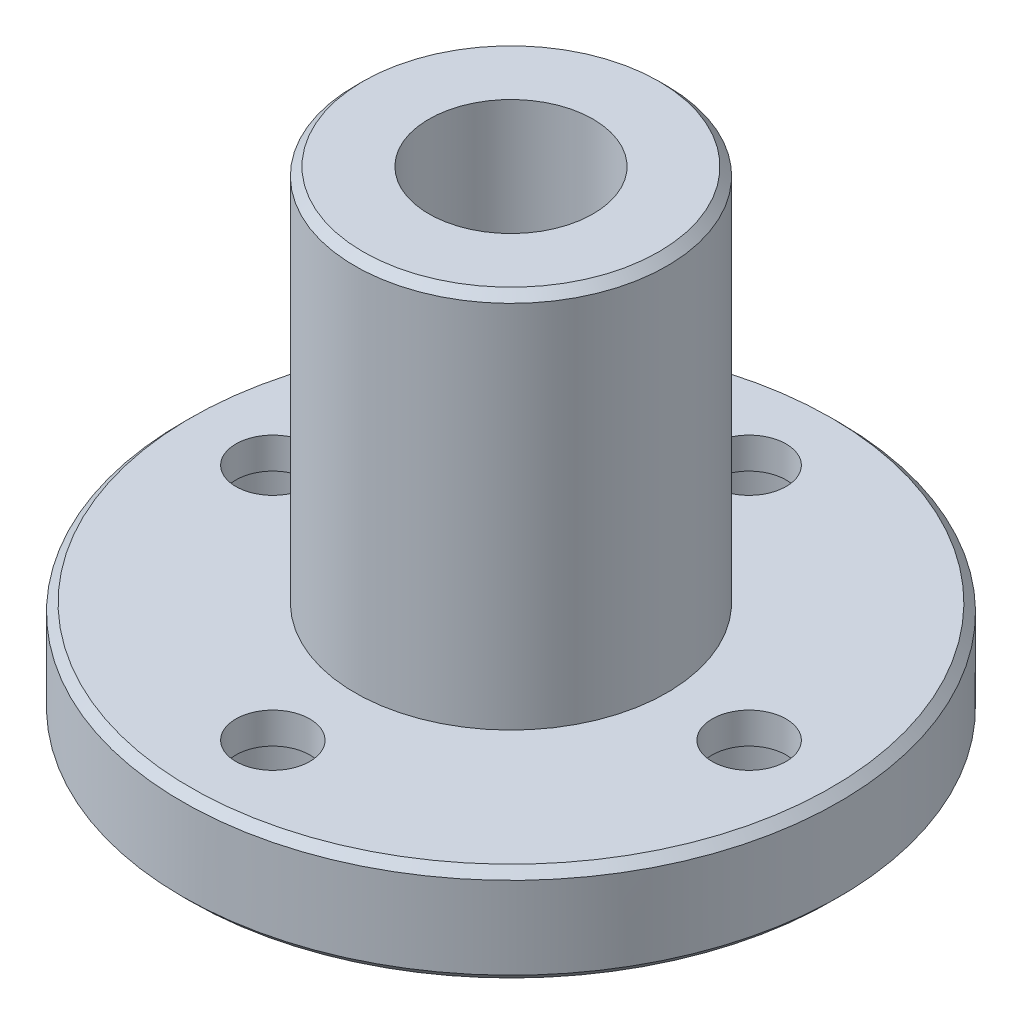
ISO-10303-21;
HEADER;
FILE_DESCRIPTION(('STEP AP214'),'2;1');
FILE_NAME('part.step','',(''),(''),'','','');
FILE_SCHEMA(('AUTOMOTIVE_DESIGN { 1 0 10303 214 1 1 1 1 }'));
ENDSEC;
DATA;
#1=APPLICATION_CONTEXT('core data for automotive mechanical design processes');
#2=APPLICATION_PROTOCOL_DEFINITION('international standard','automotive_design',2000,#1);
#3=PRODUCT_CONTEXT('',#1,'mechanical');
#4=PRODUCT('Part','Part','',(#3));
#5=PRODUCT_RELATED_PRODUCT_CATEGORY('part','',(#4));
#6=PRODUCT_DEFINITION_FORMATION('','',#4);
#7=PRODUCT_DEFINITION_CONTEXT('part definition',#1,'design');
#8=PRODUCT_DEFINITION('design','',#6,#7);
#9=PRODUCT_DEFINITION_SHAPE('','',#8);
#10=(LENGTH_UNIT() NAMED_UNIT(*) SI_UNIT(.MILLI.,.METRE.));
#11=(NAMED_UNIT(*) PLANE_ANGLE_UNIT() SI_UNIT($,.RADIAN.));
#12=(NAMED_UNIT(*) SI_UNIT($,.STERADIAN.) SOLID_ANGLE_UNIT());
#13=UNCERTAINTY_MEASURE_WITH_UNIT(LENGTH_MEASURE(1.E-05),#10,'distance_accuracy_value','');
#14=(GEOMETRIC_REPRESENTATION_CONTEXT(3) GLOBAL_UNCERTAINTY_ASSIGNED_CONTEXT((#13)) GLOBAL_UNIT_ASSIGNED_CONTEXT((#10,
#11,#12)) REPRESENTATION_CONTEXT('',''));
#15=CARTESIAN_POINT('',(0.,0.,0.));
#16=DIRECTION('',(0.,0.,1.));
#17=DIRECTION('',(1.,0.,0.));
#18=AXIS2_PLACEMENT_3D('',#15,#16,#17);
#19=CARTESIAN_POINT('',(-14.5,29.,0.));
#20=DIRECTION('',(0.,-1.,0.));
#21=DIRECTION('',(0.,0.,-1.));
#22=AXIS2_PLACEMENT_3D('',#19,#20,#21);
#23=CYLINDRICAL_SURFACE('',#22,2.25000000000015);
#24=CARTESIAN_POINT('',(-14.5,6.,0.));
#25=DIRECTION('',(0.,-1.,0.));
#26=DIRECTION('',(0.,0.,-1.));
#27=AXIS2_PLACEMENT_3D('',#24,#25,#26);
#28=CIRCLE('',#27,2.25000000000015);
#29=CARTESIAN_POINT('',(-14.5,6.,-2.25000000000015));
#30=VERTEX_POINT('',#29);
#31=EDGE_CURVE('E73',#30,#30,#28,.T.);
#32=CARTESIAN_POINT('',(-14.5,4.1,0.));
#33=DIRECTION('',(0.,-1.,0.));
#34=DIRECTION('',(0.,0.,-1.));
#35=AXIS2_PLACEMENT_3D('',#32,#33,#34);
#36=CIRCLE('',#35,2.25000000000015);
#37=CARTESIAN_POINT('',(-14.5,4.1,-2.25000000000015));
#38=VERTEX_POINT('',#37);
#39=EDGE_CURVE('E59',#38,#38,#36,.F.);
#40=CARTESIAN_POINT('',(-14.5,6.,-2.25000000000015));
#41=CARTESIAN_POINT('',(-14.5,5.98020833333333,-2.25000000000015));
#42=CARTESIAN_POINT('',(-14.5,5.96041666666667,-2.25000000000015));
#43=CARTESIAN_POINT('',(-14.5,5.92083333333333,-2.25000000000015));
#44=CARTESIAN_POINT('',(-14.5,5.90104166666666,-2.25000000000015));
#45=CARTESIAN_POINT('',(-14.5,5.86145833333333,-2.25000000000015));
#46=CARTESIAN_POINT('',(-14.5,5.84166666666666,-2.25000000000015));
#47=CARTESIAN_POINT('',(-14.5,5.80208333333333,-2.25000000000015));
#48=CARTESIAN_POINT('',(-14.5,5.78229166666666,-2.25000000000015));
#49=CARTESIAN_POINT('',(-14.5,5.74270833333333,-2.25000000000015));
#50=CARTESIAN_POINT('',(-14.5,5.72291666666667,-2.25000000000015));
#51=CARTESIAN_POINT('',(-14.5,5.68333333333333,-2.25000000000015));
#52=CARTESIAN_POINT('',(-14.5,5.66354166666667,-2.25000000000015));
#53=CARTESIAN_POINT('',(-14.5,5.62395833333333,-2.25000000000015));
#54=CARTESIAN_POINT('',(-14.5,5.60416666666667,-2.25000000000015));
#55=CARTESIAN_POINT('',(-14.5,5.56458333333333,-2.25000000000015));
#56=CARTESIAN_POINT('',(-14.5,5.54479166666667,-2.25000000000015));
#57=CARTESIAN_POINT('',(-14.5,5.50520833333333,-2.25000000000015));
#58=CARTESIAN_POINT('',(-14.5,5.48541666666667,-2.25000000000015));
#59=CARTESIAN_POINT('',(-14.5,5.44583333333333,-2.25000000000015));
#60=CARTESIAN_POINT('',(-14.5,5.42604166666666,-2.25000000000015));
#61=CARTESIAN_POINT('',(-14.5,5.38645833333333,-2.25000000000015));
#62=CARTESIAN_POINT('',(-14.5,5.36666666666666,-2.25000000000015));
#63=CARTESIAN_POINT('',(-14.5,5.32708333333333,-2.25000000000015));
#64=CARTESIAN_POINT('',(-14.5,5.30729166666667,-2.25000000000015));
#65=CARTESIAN_POINT('',(-14.5,5.26770833333333,-2.25000000000015));
#66=CARTESIAN_POINT('',(-14.5,5.24791666666667,-2.25000000000015));
#67=CARTESIAN_POINT('',(-14.5,5.20833333333333,-2.25000000000015));
#68=CARTESIAN_POINT('',(-14.5,5.18854166666667,-2.25000000000015));
#69=CARTESIAN_POINT('',(-14.5,5.14895833333333,-2.25000000000015));
#70=CARTESIAN_POINT('',(-14.5,5.12916666666667,-2.25000000000015));
#71=CARTESIAN_POINT('',(-14.5,5.08958333333333,-2.25000000000015));
#72=CARTESIAN_POINT('',(-14.5,5.06979166666667,-2.25000000000015));
#73=CARTESIAN_POINT('',(-14.5,5.03020833333333,-2.25000000000015));
#74=CARTESIAN_POINT('',(-14.5,5.01041666666667,-2.25000000000015));
#75=CARTESIAN_POINT('',(-14.5,4.97083333333333,-2.25000000000015));
#76=CARTESIAN_POINT('',(-14.5,4.95104166666667,-2.25000000000015));
#77=CARTESIAN_POINT('',(-14.5,4.91145833333333,-2.25000000000015));
#78=CARTESIAN_POINT('',(-14.5,4.89166666666666,-2.25000000000015));
#79=CARTESIAN_POINT('',(-14.5,4.85208333333333,-2.25000000000015));
#80=CARTESIAN_POINT('',(-14.5,4.83229166666666,-2.25000000000015));
#81=CARTESIAN_POINT('',(-14.5,4.79270833333333,-2.25000000000015));
#82=CARTESIAN_POINT('',(-14.5,4.77291666666667,-2.25000000000015));
#83=CARTESIAN_POINT('',(-14.5,4.73333333333333,-2.25000000000015));
#84=CARTESIAN_POINT('',(-14.5,4.71354166666667,-2.25000000000015));
#85=CARTESIAN_POINT('',(-14.5,4.67395833333333,-2.25000000000015));
#86=CARTESIAN_POINT('',(-14.5,4.65416666666667,-2.25000000000015));
#87=CARTESIAN_POINT('',(-14.5,4.61458333333333,-2.25000000000015));
#88=CARTESIAN_POINT('',(-14.5,4.59479166666667,-2.25000000000015));
#89=CARTESIAN_POINT('',(-14.5,4.55520833333333,-2.25000000000015));
#90=CARTESIAN_POINT('',(-14.5,4.53541666666667,-2.25000000000015));
#91=CARTESIAN_POINT('',(-14.5,4.49583333333333,-2.25000000000015));
#92=CARTESIAN_POINT('',(-14.5,4.47604166666667,-2.25000000000015));
#93=CARTESIAN_POINT('',(-14.5,4.43645833333333,-2.25000000000015));
#94=CARTESIAN_POINT('',(-14.5,4.41666666666667,-2.25000000000015));
#95=CARTESIAN_POINT('',(-14.5,4.37708333333333,-2.25000000000015));
#96=CARTESIAN_POINT('',(-14.5,4.35729166666667,-2.25000000000015));
#97=CARTESIAN_POINT('',(-14.5,4.31770833333333,-2.25000000000015));
#98=CARTESIAN_POINT('',(-14.5,4.29791666666667,-2.25000000000015));
#99=CARTESIAN_POINT('',(-14.5,4.25833333333333,-2.25000000000015));
#100=CARTESIAN_POINT('',(-14.5,4.23854166666667,-2.25000000000015));
#101=CARTESIAN_POINT('',(-14.5,4.19895833333333,-2.25000000000015));
#102=CARTESIAN_POINT('',(-14.5,4.17916666666667,-2.25000000000015));
#103=CARTESIAN_POINT('',(-14.5,4.13958333333333,-2.25000000000015));
#104=CARTESIAN_POINT('',(-14.5,4.11979166666667,-2.25000000000015));
#105=CARTESIAN_POINT('',(-14.5,4.1,-2.25000000000015));
#106=B_SPLINE_CURVE_WITH_KNOTS('',3,(#40,#41,#42,#43,#44,#45,#46,#47,#48,#49,#50,#51,#52,#53,
#54,#55,#56,#57,#58,#59,#60,#61,#62,#63,#64,#65,#66,#67,#68,#69,#70,#71,#72,#73,#74,#75,#76,#77,
#78,#79,#80,#81,#82,#83,#84,#85,#86,#87,#88,#89,#90,#91,#92,#93,#94,#95,#96,#97,#98,#99,#100,
#101,#102,#103,#104,#105),.UNSPECIFIED.,.F.,.F.,(4,2,2,2,2,2,2,2,2,2,2,2,2,2,2,2,2,2,2,2,2,2,2,
2,2,2,2,2,2,2,2,2,4),(0.,0.0593750000000004,0.118750000000001,0.178125000000001,
0.237500000000002,0.296874999999999,0.356249999999999,0.415624999999999,0.475,0.534375,
0.593750000000001,0.653125000000001,0.712499999999998,0.771874999999998,0.831249999999999,
0.890624999999999,0.95,1.009375,1.06875,1.128125,1.1875,1.246875,1.30625,1.365625,1.425,
1.484375,1.54375,1.603125,1.6625,1.721875,1.78125,1.840625,1.9),.UNSPECIFIED.);
#107=EDGE_CURVE('BSEAM32',#30,#38,#106,.T.);
#108=ORIENTED_EDGE('',*,*,#31,.F.);
#109=ORIENTED_EDGE('',*,*,#39,.F.);
#110=ORIENTED_EDGE('',*,*,#107,.T.);
#111=ORIENTED_EDGE('',*,*,#107,.F.);
#112=EDGE_LOOP('',(#108,#110,#109,#111));
#113=FACE_BOUND('',#112,.T.);
#114=ADVANCED_FACE('F32',(#113),#23,.F.);
#115=CARTESIAN_POINT('',(0.,29.,-14.5));
#116=DIRECTION('',(0.,-1.,0.));
#117=DIRECTION('',(0.,0.,-1.));
#118=AXIS2_PLACEMENT_3D('',#115,#116,#117);
#119=CYLINDRICAL_SURFACE('',#118,2.2500000000001);
#120=CARTESIAN_POINT('',(0.,6.,-14.5));
#121=DIRECTION('',(0.,-1.,0.));
#122=DIRECTION('',(0.,0.,-1.));
#123=AXIS2_PLACEMENT_3D('',#120,#121,#122);
#124=CIRCLE('',#123,2.2500000000001);
#125=CARTESIAN_POINT('',(0.,6.,-16.7500000000001));
#126=VERTEX_POINT('',#125);
#127=EDGE_CURVE('E79',#126,#126,#124,.T.);
#128=CARTESIAN_POINT('',(0.,4.1,-14.5));
#129=DIRECTION('',(0.,-1.,0.));
#130=DIRECTION('',(0.,0.,-1.));
#131=AXIS2_PLACEMENT_3D('',#128,#129,#130);
#132=CIRCLE('',#131,2.2500000000001);
#133=CARTESIAN_POINT('',(0.,4.1,-16.7500000000001));
#134=VERTEX_POINT('',#133);
#135=EDGE_CURVE('E63',#134,#134,#132,.F.);
#136=CARTESIAN_POINT('',(0.,6.,-16.7500000000001));
#137=CARTESIAN_POINT('',(0.,5.98020833333333,-16.7500000000001));
#138=CARTESIAN_POINT('',(0.,5.96041666666667,-16.7500000000001));
#139=CARTESIAN_POINT('',(0.,5.92083333333333,-16.7500000000001));
#140=CARTESIAN_POINT('',(0.,5.90104166666666,-16.7500000000001));
#141=CARTESIAN_POINT('',(0.,5.86145833333333,-16.7500000000001));
#142=CARTESIAN_POINT('',(0.,5.84166666666666,-16.7500000000001));
#143=CARTESIAN_POINT('',(0.,5.80208333333333,-16.7500000000001));
#144=CARTESIAN_POINT('',(0.,5.78229166666666,-16.7500000000001));
#145=CARTESIAN_POINT('',(0.,5.74270833333333,-16.7500000000001));
#146=CARTESIAN_POINT('',(0.,5.72291666666667,-16.7500000000001));
#147=CARTESIAN_POINT('',(0.,5.68333333333333,-16.7500000000001));
#148=CARTESIAN_POINT('',(0.,5.66354166666667,-16.7500000000001));
#149=CARTESIAN_POINT('',(0.,5.62395833333333,-16.7500000000001));
#150=CARTESIAN_POINT('',(0.,5.60416666666667,-16.7500000000001));
#151=CARTESIAN_POINT('',(0.,5.56458333333333,-16.7500000000001));
#152=CARTESIAN_POINT('',(0.,5.54479166666667,-16.7500000000001));
#153=CARTESIAN_POINT('',(0.,5.50520833333333,-16.7500000000001));
#154=CARTESIAN_POINT('',(0.,5.48541666666667,-16.7500000000001));
#155=CARTESIAN_POINT('',(0.,5.44583333333333,-16.7500000000001));
#156=CARTESIAN_POINT('',(0.,5.42604166666666,-16.7500000000001));
#157=CARTESIAN_POINT('',(0.,5.38645833333333,-16.7500000000001));
#158=CARTESIAN_POINT('',(0.,5.36666666666666,-16.7500000000001));
#159=CARTESIAN_POINT('',(0.,5.32708333333333,-16.7500000000001));
#160=CARTESIAN_POINT('',(0.,5.30729166666667,-16.7500000000001));
#161=CARTESIAN_POINT('',(0.,5.26770833333333,-16.7500000000001));
#162=CARTESIAN_POINT('',(0.,5.24791666666667,-16.7500000000001));
#163=CARTESIAN_POINT('',(0.,5.20833333333333,-16.7500000000001));
#164=CARTESIAN_POINT('',(0.,5.18854166666667,-16.7500000000001));
#165=CARTESIAN_POINT('',(0.,5.14895833333333,-16.7500000000001));
#166=CARTESIAN_POINT('',(0.,5.12916666666667,-16.7500000000001));
#167=CARTESIAN_POINT('',(0.,5.08958333333333,-16.7500000000001));
#168=CARTESIAN_POINT('',(0.,5.06979166666667,-16.7500000000001));
#169=CARTESIAN_POINT('',(0.,5.03020833333333,-16.7500000000001));
#170=CARTESIAN_POINT('',(0.,5.01041666666667,-16.7500000000001));
#171=CARTESIAN_POINT('',(0.,4.97083333333333,-16.7500000000001));
#172=CARTESIAN_POINT('',(0.,4.95104166666667,-16.7500000000001));
#173=CARTESIAN_POINT('',(0.,4.91145833333333,-16.7500000000001));
#174=CARTESIAN_POINT('',(0.,4.89166666666666,-16.7500000000001));
#175=CARTESIAN_POINT('',(0.,4.85208333333333,-16.7500000000001));
#176=CARTESIAN_POINT('',(0.,4.83229166666666,-16.7500000000001));
#177=CARTESIAN_POINT('',(0.,4.79270833333333,-16.7500000000001));
#178=CARTESIAN_POINT('',(0.,4.77291666666667,-16.7500000000001));
#179=CARTESIAN_POINT('',(0.,4.73333333333333,-16.7500000000001));
#180=CARTESIAN_POINT('',(0.,4.71354166666667,-16.7500000000001));
#181=CARTESIAN_POINT('',(0.,4.67395833333333,-16.7500000000001));
#182=CARTESIAN_POINT('',(0.,4.65416666666667,-16.7500000000001));
#183=CARTESIAN_POINT('',(0.,4.61458333333333,-16.7500000000001));
#184=CARTESIAN_POINT('',(0.,4.59479166666667,-16.7500000000001));
#185=CARTESIAN_POINT('',(0.,4.55520833333333,-16.7500000000001));
#186=CARTESIAN_POINT('',(0.,4.53541666666667,-16.7500000000001));
#187=CARTESIAN_POINT('',(0.,4.49583333333333,-16.7500000000001));
#188=CARTESIAN_POINT('',(0.,4.47604166666667,-16.7500000000001));
#189=CARTESIAN_POINT('',(0.,4.43645833333333,-16.7500000000001));
#190=CARTESIAN_POINT('',(0.,4.41666666666667,-16.7500000000001));
#191=CARTESIAN_POINT('',(0.,4.37708333333333,-16.7500000000001));
#192=CARTESIAN_POINT('',(0.,4.35729166666667,-16.7500000000001));
#193=CARTESIAN_POINT('',(0.,4.31770833333333,-16.7500000000001));
#194=CARTESIAN_POINT('',(0.,4.29791666666667,-16.7500000000001));
#195=CARTESIAN_POINT('',(0.,4.25833333333333,-16.7500000000001));
#196=CARTESIAN_POINT('',(0.,4.23854166666667,-16.7500000000001));
#197=CARTESIAN_POINT('',(0.,4.19895833333333,-16.7500000000001));
#198=CARTESIAN_POINT('',(0.,4.17916666666667,-16.7500000000001));
#199=CARTESIAN_POINT('',(0.,4.13958333333333,-16.7500000000001));
#200=CARTESIAN_POINT('',(0.,4.11979166666667,-16.7500000000001));
#201=CARTESIAN_POINT('',(0.,4.1,-16.7500000000001));
#202=B_SPLINE_CURVE_WITH_KNOTS('',3,(#136,#137,#138,#139,#140,#141,#142,#143,#144,#145,#146,
#147,#148,#149,#150,#151,#152,#153,#154,#155,#156,#157,#158,#159,#160,#161,#162,#163,#164,#165,
#166,#167,#168,#169,#170,#171,#172,#173,#174,#175,#176,#177,#178,#179,#180,#181,#182,#183,#184,
#185,#186,#187,#188,#189,#190,#191,#192,#193,#194,#195,#196,#197,#198,#199,#200,#201),
.UNSPECIFIED.,.F.,.F.,(4,2,2,2,2,2,2,2,2,2,2,2,2,2,2,2,2,2,2,2,2,2,2,2,2,2,2,2,2,2,2,2,4),(0.,
0.0593750000000004,0.118750000000001,0.178125000000001,0.237500000000002,0.296874999999999,
0.356249999999999,0.415624999999999,0.475,0.534375,0.593750000000001,0.653125000000001,
0.712499999999998,0.771874999999998,0.831249999999999,0.890624999999999,0.95,1.009375,1.06875,
1.128125,1.1875,1.246875,1.30625,1.365625,1.425,1.484375,1.54375,1.603125,1.6625,1.721875,
1.78125,1.840625,1.9),.UNSPECIFIED.);
#203=EDGE_CURVE('BSEAM153',#126,#134,#202,.T.);
#204=ORIENTED_EDGE('',*,*,#127,.F.);
#205=ORIENTED_EDGE('',*,*,#135,.F.);
#206=ORIENTED_EDGE('',*,*,#203,.T.);
#207=ORIENTED_EDGE('',*,*,#203,.F.);
#208=EDGE_LOOP('',(#204,#206,#205,#207));
#209=FACE_BOUND('',#208,.T.);
#210=ADVANCED_FACE('F153',(#209),#119,.F.);
#211=CARTESIAN_POINT('',(14.5,29.,0.));
#212=DIRECTION('',(0.,-1.,0.));
#213=DIRECTION('',(0.,0.,-1.));
#214=AXIS2_PLACEMENT_3D('',#211,#212,#213);
#215=CYLINDRICAL_SURFACE('',#214,2.25000000000005);
#216=CARTESIAN_POINT('',(14.5,6.,0.));
#217=DIRECTION('',(0.,-1.,0.));
#218=DIRECTION('',(0.,0.,-1.));
#219=AXIS2_PLACEMENT_3D('',#216,#217,#218);
#220=CIRCLE('',#219,2.25000000000005);
#221=CARTESIAN_POINT('',(14.5,6.,-2.25000000000005));
#222=VERTEX_POINT('',#221);
#223=EDGE_CURVE('E75',#222,#222,#220,.T.);
#224=CARTESIAN_POINT('',(14.5,4.1,0.));
#225=DIRECTION('',(0.,-1.,0.));
#226=DIRECTION('',(0.,0.,-1.));
#227=AXIS2_PLACEMENT_3D('',#224,#225,#226);
#228=CIRCLE('',#227,2.25000000000005);
#229=CARTESIAN_POINT('',(14.5,4.1,-2.25000000000005));
#230=VERTEX_POINT('',#229);
#231=EDGE_CURVE('E66',#230,#230,#228,.F.);
#232=CARTESIAN_POINT('',(14.5,6.,-2.25000000000005));
#233=CARTESIAN_POINT('',(14.5,5.98020833333333,-2.25000000000005));
#234=CARTESIAN_POINT('',(14.5,5.96041666666667,-2.25000000000005));
#235=CARTESIAN_POINT('',(14.5,5.92083333333333,-2.25000000000005));
#236=CARTESIAN_POINT('',(14.5,5.90104166666666,-2.25000000000005));
#237=CARTESIAN_POINT('',(14.5,5.86145833333333,-2.25000000000005));
#238=CARTESIAN_POINT('',(14.5,5.84166666666666,-2.25000000000005));
#239=CARTESIAN_POINT('',(14.5,5.80208333333333,-2.25000000000005));
#240=CARTESIAN_POINT('',(14.5,5.78229166666666,-2.25000000000005));
#241=CARTESIAN_POINT('',(14.5,5.74270833333333,-2.25000000000005));
#242=CARTESIAN_POINT('',(14.5,5.72291666666667,-2.25000000000005));
#243=CARTESIAN_POINT('',(14.5,5.68333333333333,-2.25000000000005));
#244=CARTESIAN_POINT('',(14.5,5.66354166666667,-2.25000000000005));
#245=CARTESIAN_POINT('',(14.5,5.62395833333333,-2.25000000000005));
#246=CARTESIAN_POINT('',(14.5,5.60416666666667,-2.25000000000005));
#247=CARTESIAN_POINT('',(14.5,5.56458333333333,-2.25000000000005));
#248=CARTESIAN_POINT('',(14.5,5.54479166666667,-2.25000000000005));
#249=CARTESIAN_POINT('',(14.5,5.50520833333333,-2.25000000000005));
#250=CARTESIAN_POINT('',(14.5,5.48541666666667,-2.25000000000005));
#251=CARTESIAN_POINT('',(14.5,5.44583333333333,-2.25000000000005));
#252=CARTESIAN_POINT('',(14.5,5.42604166666666,-2.25000000000005));
#253=CARTESIAN_POINT('',(14.5,5.38645833333333,-2.25000000000005));
#254=CARTESIAN_POINT('',(14.5,5.36666666666666,-2.25000000000005));
#255=CARTESIAN_POINT('',(14.5,5.32708333333333,-2.25000000000005));
#256=CARTESIAN_POINT('',(14.5,5.30729166666667,-2.25000000000005));
#257=CARTESIAN_POINT('',(14.5,5.26770833333333,-2.25000000000005));
#258=CARTESIAN_POINT('',(14.5,5.24791666666667,-2.25000000000005));
#259=CARTESIAN_POINT('',(14.5,5.20833333333333,-2.25000000000005));
#260=CARTESIAN_POINT('',(14.5,5.18854166666667,-2.25000000000005));
#261=CARTESIAN_POINT('',(14.5,5.14895833333333,-2.25000000000005));
#262=CARTESIAN_POINT('',(14.5,5.12916666666667,-2.25000000000005));
#263=CARTESIAN_POINT('',(14.5,5.08958333333333,-2.25000000000005));
#264=CARTESIAN_POINT('',(14.5,5.06979166666667,-2.25000000000005));
#265=CARTESIAN_POINT('',(14.5,5.03020833333333,-2.25000000000005));
#266=CARTESIAN_POINT('',(14.5,5.01041666666667,-2.25000000000005));
#267=CARTESIAN_POINT('',(14.5,4.97083333333333,-2.25000000000005));
#268=CARTESIAN_POINT('',(14.5,4.95104166666667,-2.25000000000005));
#269=CARTESIAN_POINT('',(14.5,4.91145833333333,-2.25000000000005));
#270=CARTESIAN_POINT('',(14.5,4.89166666666666,-2.25000000000005));
#271=CARTESIAN_POINT('',(14.5,4.85208333333333,-2.25000000000005));
#272=CARTESIAN_POINT('',(14.5,4.83229166666666,-2.25000000000005));
#273=CARTESIAN_POINT('',(14.5,4.79270833333333,-2.25000000000005));
#274=CARTESIAN_POINT('',(14.5,4.77291666666667,-2.25000000000005));
#275=CARTESIAN_POINT('',(14.5,4.73333333333333,-2.25000000000005));
#276=CARTESIAN_POINT('',(14.5,4.71354166666667,-2.25000000000005));
#277=CARTESIAN_POINT('',(14.5,4.67395833333333,-2.25000000000005));
#278=CARTESIAN_POINT('',(14.5,4.65416666666667,-2.25000000000005));
#279=CARTESIAN_POINT('',(14.5,4.61458333333333,-2.25000000000005));
#280=CARTESIAN_POINT('',(14.5,4.59479166666667,-2.25000000000005));
#281=CARTESIAN_POINT('',(14.5,4.55520833333333,-2.25000000000005));
#282=CARTESIAN_POINT('',(14.5,4.53541666666667,-2.25000000000005));
#283=CARTESIAN_POINT('',(14.5,4.49583333333333,-2.25000000000005));
#284=CARTESIAN_POINT('',(14.5,4.47604166666667,-2.25000000000005));
#285=CARTESIAN_POINT('',(14.5,4.43645833333333,-2.25000000000005));
#286=CARTESIAN_POINT('',(14.5,4.41666666666667,-2.25000000000005));
#287=CARTESIAN_POINT('',(14.5,4.37708333333333,-2.25000000000005));
#288=CARTESIAN_POINT('',(14.5,4.35729166666667,-2.25000000000005));
#289=CARTESIAN_POINT('',(14.5,4.31770833333333,-2.25000000000005));
#290=CARTESIAN_POINT('',(14.5,4.29791666666667,-2.25000000000005));
#291=CARTESIAN_POINT('',(14.5,4.25833333333333,-2.25000000000005));
#292=CARTESIAN_POINT('',(14.5,4.23854166666667,-2.25000000000005));
#293=CARTESIAN_POINT('',(14.5,4.19895833333333,-2.25000000000005));
#294=CARTESIAN_POINT('',(14.5,4.17916666666667,-2.25000000000005));
#295=CARTESIAN_POINT('',(14.5,4.13958333333333,-2.25000000000005));
#296=CARTESIAN_POINT('',(14.5,4.11979166666667,-2.25000000000005));
#297=CARTESIAN_POINT('',(14.5,4.1,-2.25000000000005));
#298=B_SPLINE_CURVE_WITH_KNOTS('',3,(#232,#233,#234,#235,#236,#237,#238,#239,#240,#241,#242,
#243,#244,#245,#246,#247,#248,#249,#250,#251,#252,#253,#254,#255,#256,#257,#258,#259,#260,#261,
#262,#263,#264,#265,#266,#267,#268,#269,#270,#271,#272,#273,#274,#275,#276,#277,#278,#279,#280,
#281,#282,#283,#284,#285,#286,#287,#288,#289,#290,#291,#292,#293,#294,#295,#296,#297),
.UNSPECIFIED.,.F.,.F.,(4,2,2,2,2,2,2,2,2,2,2,2,2,2,2,2,2,2,2,2,2,2,2,2,2,2,2,2,2,2,2,2,4),(0.,
0.0593750000000004,0.118750000000001,0.178125000000001,0.237500000000002,0.296874999999999,
0.356249999999999,0.415624999999999,0.475,0.534375,0.593750000000001,0.653125000000001,
0.712499999999998,0.771874999999998,0.831249999999999,0.890624999999999,0.95,1.009375,1.06875,
1.128125,1.1875,1.246875,1.30625,1.365625,1.425,1.484375,1.54375,1.603125,1.6625,1.721875,
1.78125,1.840625,1.9),.UNSPECIFIED.);
#299=EDGE_CURVE('BSEAM147',#222,#230,#298,.T.);
#300=ORIENTED_EDGE('',*,*,#223,.F.);
#301=ORIENTED_EDGE('',*,*,#231,.F.);
#302=ORIENTED_EDGE('',*,*,#299,.T.);
#303=ORIENTED_EDGE('',*,*,#299,.F.);
#304=EDGE_LOOP('',(#300,#302,#301,#303));
#305=FACE_BOUND('',#304,.T.);
#306=ADVANCED_FACE('F147',(#305),#215,.F.);
#307=CARTESIAN_POINT('',(0.,29.,14.5));
#308=DIRECTION('',(0.,-1.,0.));
#309=DIRECTION('',(0.,0.,-1.));
#310=AXIS2_PLACEMENT_3D('',#307,#308,#309);
#311=CYLINDRICAL_SURFACE('',#310,2.25);
#312=CARTESIAN_POINT('',(0.,6.,14.5));
#313=DIRECTION('',(0.,-1.,0.));
#314=DIRECTION('',(0.,0.,-1.));
#315=AXIS2_PLACEMENT_3D('',#312,#313,#314);
#316=CIRCLE('',#315,2.25);
#317=CARTESIAN_POINT('',(0.,6.,12.25));
#318=VERTEX_POINT('',#317);
#319=EDGE_CURVE('E78',#318,#318,#316,.T.);
#320=CARTESIAN_POINT('',(0.,4.1,14.5));
#321=DIRECTION('',(0.,-1.,0.));
#322=DIRECTION('',(0.,0.,-1.));
#323=AXIS2_PLACEMENT_3D('',#320,#321,#322);
#324=CIRCLE('',#323,2.25);
#325=CARTESIAN_POINT('',(0.,4.1,12.25));
#326=VERTEX_POINT('',#325);
#327=EDGE_CURVE('E70',#326,#326,#324,.F.);
#328=CARTESIAN_POINT('',(0.,6.,12.25));
#329=CARTESIAN_POINT('',(0.,5.98020833333333,12.25));
#330=CARTESIAN_POINT('',(0.,5.96041666666667,12.25));
#331=CARTESIAN_POINT('',(0.,5.92083333333333,12.25));
#332=CARTESIAN_POINT('',(0.,5.90104166666666,12.25));
#333=CARTESIAN_POINT('',(0.,5.86145833333333,12.25));
#334=CARTESIAN_POINT('',(0.,5.84166666666666,12.25));
#335=CARTESIAN_POINT('',(0.,5.80208333333333,12.25));
#336=CARTESIAN_POINT('',(0.,5.78229166666666,12.25));
#337=CARTESIAN_POINT('',(0.,5.74270833333333,12.25));
#338=CARTESIAN_POINT('',(0.,5.72291666666667,12.25));
#339=CARTESIAN_POINT('',(0.,5.68333333333333,12.25));
#340=CARTESIAN_POINT('',(0.,5.66354166666667,12.25));
#341=CARTESIAN_POINT('',(0.,5.62395833333333,12.25));
#342=CARTESIAN_POINT('',(0.,5.60416666666667,12.25));
#343=CARTESIAN_POINT('',(0.,5.56458333333333,12.25));
#344=CARTESIAN_POINT('',(0.,5.54479166666667,12.25));
#345=CARTESIAN_POINT('',(0.,5.50520833333333,12.25));
#346=CARTESIAN_POINT('',(0.,5.48541666666667,12.25));
#347=CARTESIAN_POINT('',(0.,5.44583333333333,12.25));
#348=CARTESIAN_POINT('',(0.,5.42604166666666,12.25));
#349=CARTESIAN_POINT('',(0.,5.38645833333333,12.25));
#350=CARTESIAN_POINT('',(0.,5.36666666666666,12.25));
#351=CARTESIAN_POINT('',(0.,5.32708333333333,12.25));
#352=CARTESIAN_POINT('',(0.,5.30729166666667,12.25));
#353=CARTESIAN_POINT('',(0.,5.26770833333333,12.25));
#354=CARTESIAN_POINT('',(0.,5.24791666666667,12.25));
#355=CARTESIAN_POINT('',(0.,5.20833333333333,12.25));
#356=CARTESIAN_POINT('',(0.,5.18854166666667,12.25));
#357=CARTESIAN_POINT('',(0.,5.14895833333333,12.25));
#358=CARTESIAN_POINT('',(0.,5.12916666666667,12.25));
#359=CARTESIAN_POINT('',(0.,5.08958333333333,12.25));
#360=CARTESIAN_POINT('',(0.,5.06979166666667,12.25));
#361=CARTESIAN_POINT('',(0.,5.03020833333333,12.25));
#362=CARTESIAN_POINT('',(0.,5.01041666666667,12.25));
#363=CARTESIAN_POINT('',(0.,4.97083333333333,12.25));
#364=CARTESIAN_POINT('',(0.,4.95104166666667,12.25));
#365=CARTESIAN_POINT('',(0.,4.91145833333333,12.25));
#366=CARTESIAN_POINT('',(0.,4.89166666666666,12.25));
#367=CARTESIAN_POINT('',(0.,4.85208333333333,12.25));
#368=CARTESIAN_POINT('',(0.,4.83229166666666,12.25));
#369=CARTESIAN_POINT('',(0.,4.79270833333333,12.25));
#370=CARTESIAN_POINT('',(0.,4.77291666666667,12.25));
#371=CARTESIAN_POINT('',(0.,4.73333333333333,12.25));
#372=CARTESIAN_POINT('',(0.,4.71354166666667,12.25));
#373=CARTESIAN_POINT('',(0.,4.67395833333333,12.25));
#374=CARTESIAN_POINT('',(0.,4.65416666666667,12.25));
#375=CARTESIAN_POINT('',(0.,4.61458333333333,12.25));
#376=CARTESIAN_POINT('',(0.,4.59479166666667,12.25));
#377=CARTESIAN_POINT('',(0.,4.55520833333333,12.25));
#378=CARTESIAN_POINT('',(0.,4.53541666666667,12.25));
#379=CARTESIAN_POINT('',(0.,4.49583333333333,12.25));
#380=CARTESIAN_POINT('',(0.,4.47604166666667,12.25));
#381=CARTESIAN_POINT('',(0.,4.43645833333333,12.25));
#382=CARTESIAN_POINT('',(0.,4.41666666666667,12.25));
#383=CARTESIAN_POINT('',(0.,4.37708333333333,12.25));
#384=CARTESIAN_POINT('',(0.,4.35729166666667,12.25));
#385=CARTESIAN_POINT('',(0.,4.31770833333333,12.25));
#386=CARTESIAN_POINT('',(0.,4.29791666666667,12.25));
#387=CARTESIAN_POINT('',(0.,4.25833333333333,12.25));
#388=CARTESIAN_POINT('',(0.,4.23854166666667,12.25));
#389=CARTESIAN_POINT('',(0.,4.19895833333333,12.25));
#390=CARTESIAN_POINT('',(0.,4.17916666666667,12.25));
#391=CARTESIAN_POINT('',(0.,4.13958333333333,12.25));
#392=CARTESIAN_POINT('',(0.,4.11979166666667,12.25));
#393=CARTESIAN_POINT('',(0.,4.1,12.25));
#394=B_SPLINE_CURVE_WITH_KNOTS('',3,(#328,#329,#330,#331,#332,#333,#334,#335,#336,#337,#338,
#339,#340,#341,#342,#343,#344,#345,#346,#347,#348,#349,#350,#351,#352,#353,#354,#355,#356,#357,
#358,#359,#360,#361,#362,#363,#364,#365,#366,#367,#368,#369,#370,#371,#372,#373,#374,#375,#376,
#377,#378,#379,#380,#381,#382,#383,#384,#385,#386,#387,#388,#389,#390,#391,#392,#393),
.UNSPECIFIED.,.F.,.F.,(4,2,2,2,2,2,2,2,2,2,2,2,2,2,2,2,2,2,2,2,2,2,2,2,2,2,2,2,2,2,2,2,4),(0.,
0.0593750000000004,0.118750000000001,0.178125000000001,0.237500000000002,0.296874999999999,
0.356249999999999,0.415624999999999,0.475,0.534375,0.593750000000001,0.653125000000001,
0.712499999999998,0.771874999999998,0.831249999999999,0.890624999999999,0.95,1.009375,1.06875,
1.128125,1.1875,1.246875,1.30625,1.365625,1.425,1.484375,1.54375,1.603125,1.6625,1.721875,
1.78125,1.840625,1.9),.UNSPECIFIED.);
#395=EDGE_CURVE('BSEAM141',#318,#326,#394,.T.);
#396=ORIENTED_EDGE('',*,*,#319,.F.);
#397=ORIENTED_EDGE('',*,*,#327,.F.);
#398=ORIENTED_EDGE('',*,*,#395,.T.);
#399=ORIENTED_EDGE('',*,*,#395,.F.);
#400=EDGE_LOOP('',(#396,#398,#397,#399));
#401=FACE_BOUND('',#400,.T.);
#402=ADVANCED_FACE('F141',(#401),#311,.F.);
#403=CARTESIAN_POINT('',(0.,0.,0.));
#404=DIRECTION('',(0.,-1.,0.));
#405=DIRECTION('',(0.,0.,-1.));
#406=AXIS2_PLACEMENT_3D('',#403,#404,#405);
#407=CYLINDRICAL_SURFACE('',#406,5.);
#408=CARTESIAN_POINT('',(0.,29.,0.));
#409=DIRECTION('',(0.,-1.,0.));
#410=DIRECTION('',(0.,0.,-1.));
#411=AXIS2_PLACEMENT_3D('',#408,#409,#410);
#412=CIRCLE('',#411,5.);
#413=CARTESIAN_POINT('',(0.,29.,-5.));
#414=VERTEX_POINT('',#413);
#415=EDGE_CURVE('E86',#414,#414,#412,.T.);
#416=ORIENTED_EDGE('',*,*,#415,.F.);
#417=EDGE_LOOP('',(#416));
#418=FACE_BOUND('',#417,.T.);
#419=CARTESIAN_POINT('',(0.,0.,0.));
#420=DIRECTION('',(0.,-1.,0.));
#421=DIRECTION('',(0.,0.,-1.));
#422=AXIS2_PLACEMENT_3D('',#419,#420,#421);
#423=CIRCLE('',#422,5.);
#424=CARTESIAN_POINT('',(0.,0.,-5.));
#425=VERTEX_POINT('',#424);
#426=EDGE_CURVE('E58',#425,#425,#423,.T.);
#427=ORIENTED_EDGE('',*,*,#426,.T.);
#428=EDGE_LOOP('',(#427));
#429=FACE_BOUND('',#428,.T.);
#430=ADVANCED_FACE('F130',(#418,#429),#407,.F.);
#431=CARTESIAN_POINT('',(-5.,0.,0.));
#432=DIRECTION('',(0.,1.,0.));
#433=DIRECTION('',(0.,0.,1.));
#434=AXIS2_PLACEMENT_3D('',#431,#432,#433);
#435=PLANE('',#434);
#436=CARTESIAN_POINT('',(0.,0.,0.));
#437=DIRECTION('',(0.,1.,0.));
#438=DIRECTION('',(0.,0.,1.));
#439=AXIS2_PLACEMENT_3D('',#436,#437,#438);
#440=CIRCLE('',#439,19.5);
#441=CARTESIAN_POINT('',(0.,0.,19.5));
#442=VERTEX_POINT('',#441);
#443=EDGE_CURVE('E10',#442,#442,#440,.F.);
#444=ORIENTED_EDGE('',*,*,#443,.T.);
#445=EDGE_LOOP('',(#444));
#446=FACE_BOUND('',#445,.T.);
#447=CARTESIAN_POINT('',(14.5,0.,0.));
#448=DIRECTION('',(0.,-1.,0.));
#449=DIRECTION('',(0.,0.,-1.));
#450=AXIS2_PLACEMENT_3D('',#447,#448,#449);
#451=CIRCLE('',#450,3.75000000000005);
#452=CARTESIAN_POINT('',(14.5,0.,-3.75000000000005));
#453=VERTEX_POINT('',#452);
#454=EDGE_CURVE('E110',#453,#453,#451,.T.);
#455=ORIENTED_EDGE('',*,*,#454,.F.);
#456=EDGE_LOOP('',(#455));
#457=FACE_BOUND('',#456,.T.);
#458=CARTESIAN_POINT('',(0.,0.,-14.5));
#459=DIRECTION('',(0.,-1.,0.));
#460=DIRECTION('',(0.,0.,-1.));
#461=AXIS2_PLACEMENT_3D('',#458,#459,#460);
#462=CIRCLE('',#461,3.75000000000009);
#463=CARTESIAN_POINT('',(0.,0.,-18.2500000000001));
#464=VERTEX_POINT('',#463);
#465=EDGE_CURVE('E104',#464,#464,#462,.T.);
#466=ORIENTED_EDGE('',*,*,#465,.F.);
#467=EDGE_LOOP('',(#466));
#468=FACE_BOUND('',#467,.T.);
#469=CARTESIAN_POINT('',(-14.5,0.,0.));
#470=DIRECTION('',(0.,-1.,0.));
#471=DIRECTION('',(0.,0.,-1.));
#472=AXIS2_PLACEMENT_3D('',#469,#470,#471);
#473=CIRCLE('',#472,3.75000000000014);
#474=CARTESIAN_POINT('',(-14.5,0.,-3.75000000000014));
#475=VERTEX_POINT('',#474);
#476=EDGE_CURVE('E98',#475,#475,#473,.T.);
#477=ORIENTED_EDGE('',*,*,#476,.F.);
#478=EDGE_LOOP('',(#477));
#479=FACE_BOUND('',#478,.T.);
#480=CARTESIAN_POINT('',(0.,0.,14.5));
#481=DIRECTION('',(0.,-1.,0.));
#482=DIRECTION('',(0.,0.,-1.));
#483=AXIS2_PLACEMENT_3D('',#480,#481,#482);
#484=CIRCLE('',#483,3.75);
#485=CARTESIAN_POINT('',(0.,0.,10.75));
#486=VERTEX_POINT('',#485);
#487=EDGE_CURVE('E62',#486,#486,#484,.T.);
#488=ORIENTED_EDGE('',*,*,#487,.F.);
#489=EDGE_LOOP('',(#488));
#490=FACE_BOUND('',#489,.T.);
#491=ORIENTED_EDGE('',*,*,#426,.F.);
#492=EDGE_LOOP('',(#491));
#493=FACE_BOUND('',#492,.T.);
#494=ADVANCED_FACE('F126',(#446,#457,#468,#479,#490,#493),#435,.F.);
#495=CARTESIAN_POINT('',(0.,0.,0.));
#496=DIRECTION('',(0.,-1.,0.));
#497=DIRECTION('',(0.,0.,-1.));
#498=AXIS2_PLACEMENT_3D('',#495,#496,#497);
#499=CYLINDRICAL_SURFACE('',#498,20.);
#500=CARTESIAN_POINT('',(0.,5.5,0.));
#501=DIRECTION('',(0.,-1.,0.));
#502=DIRECTION('',(0.,0.,-1.));
#503=AXIS2_PLACEMENT_3D('',#500,#501,#502);
#504=CIRCLE('',#503,20.);
#505=CARTESIAN_POINT('',(0.,5.5,-20.));
#506=VERTEX_POINT('',#505);
#507=EDGE_CURVE('E43',#506,#506,#504,.T.);
#508=ORIENTED_EDGE('',*,*,#507,.T.);
#509=EDGE_LOOP('',(#508));
#510=FACE_BOUND('',#509,.T.);
#511=CARTESIAN_POINT('',(0.,0.499999999999996,0.));
#512=DIRECTION('',(0.,1.,0.));
#513=DIRECTION('',(0.,0.,1.));
#514=AXIS2_PLACEMENT_3D('',#511,#512,#513);
#515=CIRCLE('',#514,20.);
#516=CARTESIAN_POINT('',(0.,0.499999999999996,20.));
#517=VERTEX_POINT('',#516);
#518=EDGE_CURVE('E47',#517,#517,#515,.T.);
#519=ORIENTED_EDGE('',*,*,#518,.T.);
#520=EDGE_LOOP('',(#519));
#521=FACE_BOUND('',#520,.T.);
#522=ADVANCED_FACE('F129',(#510,#521),#499,.T.);
#523=CARTESIAN_POINT('',(-20.,6.,0.));
#524=DIRECTION('',(0.,-1.,0.));
#525=DIRECTION('',(0.,0.,-1.));
#526=AXIS2_PLACEMENT_3D('',#523,#524,#525);
#527=PLANE('',#526);
#528=CARTESIAN_POINT('',(0.,6.,0.));
#529=DIRECTION('',(0.,-1.,0.));
#530=DIRECTION('',(0.,0.,-1.));
#531=AXIS2_PLACEMENT_3D('',#528,#529,#530);
#532=CIRCLE('',#531,19.5);
#533=CARTESIAN_POINT('',(0.,6.,-19.5));
#534=VERTEX_POINT('',#533);
#535=EDGE_CURVE('E39',#534,#534,#532,.F.);
#536=ORIENTED_EDGE('',*,*,#535,.T.);
#537=EDGE_LOOP('',(#536));
#538=FACE_BOUND('',#537,.T.);
#539=ORIENTED_EDGE('',*,*,#223,.T.);
#540=EDGE_LOOP('',(#539));
#541=FACE_BOUND('',#540,.T.);
#542=ORIENTED_EDGE('',*,*,#127,.T.);
#543=EDGE_LOOP('',(#542));
#544=FACE_BOUND('',#543,.T.);
#545=ORIENTED_EDGE('',*,*,#31,.T.);
#546=EDGE_LOOP('',(#545));
#547=FACE_BOUND('',#546,.T.);
#548=ORIENTED_EDGE('',*,*,#319,.T.);
#549=EDGE_LOOP('',(#548));
#550=FACE_BOUND('',#549,.T.);
#551=CARTESIAN_POINT('',(0.,6.,0.));
#552=DIRECTION('',(0.,-1.,0.));
#553=DIRECTION('',(0.,0.,-1.));
#554=AXIS2_PLACEMENT_3D('',#551,#552,#553);
#555=CIRCLE('',#554,9.5);
#556=CARTESIAN_POINT('',(0.,6.,-9.5));
#557=VERTEX_POINT('',#556);
#558=EDGE_CURVE('E89',#557,#557,#555,.T.);
#559=ORIENTED_EDGE('',*,*,#558,.T.);
#560=EDGE_LOOP('',(#559));
#561=FACE_BOUND('',#560,.T.);
#562=ADVANCED_FACE('F173',(#538,#541,#544,#547,#550,#561),#527,.F.);
#563=CARTESIAN_POINT('',(0.,0.,0.));
#564=DIRECTION('',(0.,-1.,0.));
#565=DIRECTION('',(0.,0.,-1.));
#566=AXIS2_PLACEMENT_3D('',#563,#564,#565);
#567=CYLINDRICAL_SURFACE('',#566,9.5);
#568=CARTESIAN_POINT('',(0.,28.5,0.));
#569=DIRECTION('',(0.,-1.,0.));
#570=DIRECTION('',(0.,0.,-1.));
#571=AXIS2_PLACEMENT_3D('',#568,#569,#570);
#572=CIRCLE('',#571,9.5);
#573=CARTESIAN_POINT('',(0.,28.5,-9.5));
#574=VERTEX_POINT('',#573);
#575=EDGE_CURVE('E55',#574,#574,#572,.T.);
#576=ORIENTED_EDGE('',*,*,#575,.T.);
#577=EDGE_LOOP('',(#576));
#578=FACE_BOUND('',#577,.T.);
#579=ORIENTED_EDGE('',*,*,#558,.F.);
#580=EDGE_LOOP('',(#579));
#581=FACE_BOUND('',#580,.T.);
#582=ADVANCED_FACE('F169',(#578,#581),#567,.T.);
#583=CARTESIAN_POINT('',(-9.5,29.,0.));
#584=DIRECTION('',(0.,-1.,0.));
#585=DIRECTION('',(0.,0.,-1.));
#586=AXIS2_PLACEMENT_3D('',#583,#584,#585);
#587=PLANE('',#586);
#588=CARTESIAN_POINT('',(0.,29.,0.));
#589=DIRECTION('',(0.,-1.,0.));
#590=DIRECTION('',(0.,0.,-1.));
#591=AXIS2_PLACEMENT_3D('',#588,#589,#590);
#592=CIRCLE('',#591,8.99999999999999);
#593=CARTESIAN_POINT('',(0.,29.,-8.99999999999999));
#594=VERTEX_POINT('',#593);
#595=EDGE_CURVE('E52',#594,#594,#592,.F.);
#596=ORIENTED_EDGE('',*,*,#595,.T.);
#597=EDGE_LOOP('',(#596));
#598=FACE_BOUND('',#597,.T.);
#599=ORIENTED_EDGE('',*,*,#415,.T.);
#600=EDGE_LOOP('',(#599));
#601=FACE_BOUND('',#600,.T.);
#602=ADVANCED_FACE('F165',(#598,#601),#587,.F.);
#603=CARTESIAN_POINT('',(0.,4.1,14.5));
#604=DIRECTION('',(0.,-1.,0.));
#605=DIRECTION('',(0.,0.,-1.));
#606=AXIS2_PLACEMENT_3D('',#603,#604,#605);
#607=PLANE('',#606);
#608=CARTESIAN_POINT('',(0.,4.1,14.5));
#609=DIRECTION('',(0.,-1.,0.));
#610=DIRECTION('',(0.,0.,-1.));
#611=AXIS2_PLACEMENT_3D('',#608,#609,#610);
#612=CIRCLE('',#611,3.75);
#613=CARTESIAN_POINT('',(0.,4.1,10.75));
#614=VERTEX_POINT('',#613);
#615=EDGE_CURVE('E74',#614,#614,#612,.T.);
#616=ORIENTED_EDGE('',*,*,#615,.T.);
#617=EDGE_LOOP('',(#616));
#618=FACE_BOUND('',#617,.T.);
#619=ORIENTED_EDGE('',*,*,#327,.T.);
#620=EDGE_LOOP('',(#619));
#621=FACE_BOUND('',#620,.T.);
#622=ADVANCED_FACE('F168',(#618,#621),#607,.T.);
#623=CARTESIAN_POINT('',(0.,4.1,14.5));
#624=DIRECTION('',(0.,-1.,0.));
#625=DIRECTION('',(0.,0.,-1.));
#626=AXIS2_PLACEMENT_3D('',#623,#624,#625);
#627=CYLINDRICAL_SURFACE('',#626,3.75);
#628=ORIENTED_EDGE('',*,*,#615,.F.);
#629=EDGE_LOOP('',(#628));
#630=FACE_BOUND('',#629,.T.);
#631=ORIENTED_EDGE('',*,*,#487,.T.);
#632=EDGE_LOOP('',(#631));
#633=FACE_BOUND('',#632,.T.);
#634=ADVANCED_FACE('F224',(#630,#633),#627,.F.);
#635=CARTESIAN_POINT('',(14.5,4.1,0.));
#636=DIRECTION('',(0.,-1.,0.));
#637=DIRECTION('',(0.,0.,-1.));
#638=AXIS2_PLACEMENT_3D('',#635,#636,#637);
#639=PLANE('',#638);
#640=CARTESIAN_POINT('',(14.5,4.1,0.));
#641=DIRECTION('',(0.,-1.,0.));
#642=DIRECTION('',(0.,0.,-1.));
#643=AXIS2_PLACEMENT_3D('',#640,#641,#642);
#644=CIRCLE('',#643,3.75000000000005);
#645=CARTESIAN_POINT('',(14.5,4.1,-3.75000000000005));
#646=VERTEX_POINT('',#645);
#647=EDGE_CURVE('E69',#646,#646,#644,.T.);
#648=ORIENTED_EDGE('',*,*,#647,.T.);
#649=EDGE_LOOP('',(#648));
#650=FACE_BOUND('',#649,.T.);
#651=ORIENTED_EDGE('',*,*,#231,.T.);
#652=EDGE_LOOP('',(#651));
#653=FACE_BOUND('',#652,.T.);
#654=ADVANCED_FACE('F116',(#650,#653),#639,.T.);
#655=CARTESIAN_POINT('',(14.5,4.1,0.));
#656=DIRECTION('',(0.,-1.,0.));
#657=DIRECTION('',(0.,0.,-1.));
#658=AXIS2_PLACEMENT_3D('',#655,#656,#657);
#659=CYLINDRICAL_SURFACE('',#658,3.75000000000005);
#660=ORIENTED_EDGE('',*,*,#647,.F.);
#661=EDGE_LOOP('',(#660));
#662=FACE_BOUND('',#661,.T.);
#663=ORIENTED_EDGE('',*,*,#454,.T.);
#664=EDGE_LOOP('',(#663));
#665=FACE_BOUND('',#664,.T.);
#666=ADVANCED_FACE('F119',(#662,#665),#659,.F.);
#667=CARTESIAN_POINT('',(0.,4.1,-14.5));
#668=DIRECTION('',(0.,-1.,0.));
#669=DIRECTION('',(0.,0.,-1.));
#670=AXIS2_PLACEMENT_3D('',#667,#668,#669);
#671=PLANE('',#670);
#672=CARTESIAN_POINT('',(0.,4.1,-14.5));
#673=DIRECTION('',(0.,-1.,0.));
#674=DIRECTION('',(0.,0.,-1.));
#675=AXIS2_PLACEMENT_3D('',#672,#673,#674);
#676=CIRCLE('',#675,3.75000000000009);
#677=CARTESIAN_POINT('',(0.,4.1,-18.2500000000001));
#678=VERTEX_POINT('',#677);
#679=EDGE_CURVE('E107',#678,#678,#676,.T.);
#680=ORIENTED_EDGE('',*,*,#679,.T.);
#681=EDGE_LOOP('',(#680));
#682=FACE_BOUND('',#681,.T.);
#683=ORIENTED_EDGE('',*,*,#135,.T.);
#684=EDGE_LOOP('',(#683));
#685=FACE_BOUND('',#684,.T.);
#686=ADVANCED_FACE('F122',(#682,#685),#671,.T.);
#687=CARTESIAN_POINT('',(0.,4.1,-14.5));
#688=DIRECTION('',(0.,-1.,0.));
#689=DIRECTION('',(0.,0.,-1.));
#690=AXIS2_PLACEMENT_3D('',#687,#688,#689);
#691=CYLINDRICAL_SURFACE('',#690,3.75000000000009);
#692=ORIENTED_EDGE('',*,*,#679,.F.);
#693=EDGE_LOOP('',(#692));
#694=FACE_BOUND('',#693,.T.);
#695=ORIENTED_EDGE('',*,*,#465,.T.);
#696=EDGE_LOOP('',(#695));
#697=FACE_BOUND('',#696,.T.);
#698=ADVANCED_FACE('F215',(#694,#697),#691,.F.);
#699=CARTESIAN_POINT('',(-14.5,4.1,0.));
#700=DIRECTION('',(0.,-1.,0.));
#701=DIRECTION('',(0.,0.,-1.));
#702=AXIS2_PLACEMENT_3D('',#699,#700,#701);
#703=PLANE('',#702);
#704=CARTESIAN_POINT('',(-14.5,4.1,0.));
#705=DIRECTION('',(0.,-1.,0.));
#706=DIRECTION('',(0.,0.,-1.));
#707=AXIS2_PLACEMENT_3D('',#704,#705,#706);
#708=CIRCLE('',#707,3.75000000000014);
#709=CARTESIAN_POINT('',(-14.5,4.1,-3.75000000000014));
#710=VERTEX_POINT('',#709);
#711=EDGE_CURVE('E101',#710,#710,#708,.T.);
#712=ORIENTED_EDGE('',*,*,#711,.T.);
#713=EDGE_LOOP('',(#712));
#714=FACE_BOUND('',#713,.T.);
#715=ORIENTED_EDGE('',*,*,#39,.T.);
#716=EDGE_LOOP('',(#715));
#717=FACE_BOUND('',#716,.T.);
#718=ADVANCED_FACE('F202',(#714,#717),#703,.T.);
#719=CARTESIAN_POINT('',(-14.5,4.1,0.));
#720=DIRECTION('',(0.,-1.,0.));
#721=DIRECTION('',(0.,0.,-1.));
#722=AXIS2_PLACEMENT_3D('',#719,#720,#721);
#723=CYLINDRICAL_SURFACE('',#722,3.75000000000014);
#724=ORIENTED_EDGE('',*,*,#711,.F.);
#725=EDGE_LOOP('',(#724));
#726=FACE_BOUND('',#725,.T.);
#727=ORIENTED_EDGE('',*,*,#476,.T.);
#728=EDGE_LOOP('',(#727));
#729=FACE_BOUND('',#728,.T.);
#730=ADVANCED_FACE('F196',(#726,#729),#723,.F.);
#731=CARTESIAN_POINT('',(0.,28.5,0.));
#732=DIRECTION('',(0.,-1.,0.));
#733=DIRECTION('',(0.,0.,-1.));
#734=AXIS2_PLACEMENT_3D('',#731,#732,#733);
#735=CONICAL_SURFACE('',#734,9.5,0.785398163397454);
#736=ORIENTED_EDGE('',*,*,#595,.F.);
#737=EDGE_LOOP('',(#736));
#738=FACE_BOUND('',#737,.T.);
#739=ORIENTED_EDGE('',*,*,#575,.F.);
#740=EDGE_LOOP('',(#739));
#741=FACE_BOUND('',#740,.T.);
#742=ADVANCED_FACE('F191',(#738,#741),#735,.T.);
#743=CARTESIAN_POINT('',(0.,5.5,0.));
#744=DIRECTION('',(0.,-1.,0.));
#745=DIRECTION('',(0.,0.,-1.));
#746=AXIS2_PLACEMENT_3D('',#743,#744,#745);
#747=CONICAL_SURFACE('',#746,20.,0.785398163397452);
#748=ORIENTED_EDGE('',*,*,#535,.F.);
#749=EDGE_LOOP('',(#748));
#750=FACE_BOUND('',#749,.T.);
#751=ORIENTED_EDGE('',*,*,#507,.F.);
#752=EDGE_LOOP('',(#751));
#753=FACE_BOUND('',#752,.T.);
#754=ADVANCED_FACE('F187',(#750,#753),#747,.T.);
#755=CARTESIAN_POINT('',(0.,0.,0.));
#756=DIRECTION('',(0.,1.,0.));
#757=DIRECTION('',(0.,0.,1.));
#758=AXIS2_PLACEMENT_3D('',#755,#756,#757);
#759=CONICAL_SURFACE('',#758,19.5,0.785398163397434);
#760=ORIENTED_EDGE('',*,*,#518,.F.);
#761=EDGE_LOOP('',(#760));
#762=FACE_BOUND('',#761,.T.);
#763=ORIENTED_EDGE('',*,*,#443,.F.);
#764=EDGE_LOOP('',(#763));
#765=FACE_BOUND('',#764,.T.);
#766=ADVANCED_FACE('F34',(#762,#765),#759,.T.);
#767=CLOSED_SHELL('',(#114,#210,#306,#402,#430,#494,#522,#562,#582,#602,#622,#634,#654,#666,
#686,#698,#718,#730,#742,#754,#766));
#768=MANIFOLD_SOLID_BREP('B2',#767);
#769=ADVANCED_BREP_SHAPE_REPRESENTATION('',(#18,#768),#14);
#770=SHAPE_DEFINITION_REPRESENTATION(#9,#769);
ENDSEC;
END-ISO-10303-21;
